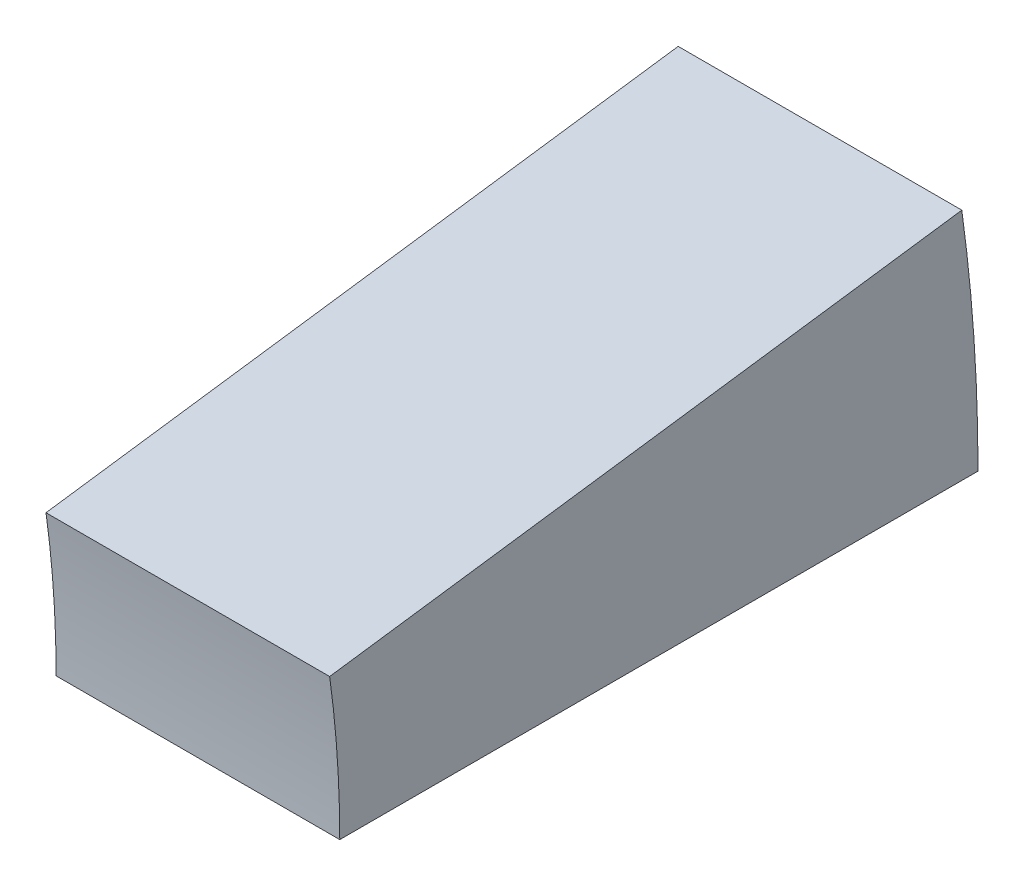
ISO-10303-21;
HEADER;
FILE_DESCRIPTION(('STEP AP214'),'2;1');
FILE_NAME('part.step','',(''),(''),'','','');
FILE_SCHEMA(('AUTOMOTIVE_DESIGN { 1 0 10303 214 1 1 1 1 }'));
ENDSEC;
DATA;
#1=APPLICATION_CONTEXT('core data for automotive mechanical design processes');
#2=APPLICATION_PROTOCOL_DEFINITION('international standard','automotive_design',2000,#1);
#3=PRODUCT_CONTEXT('',#1,'mechanical');
#4=PRODUCT('Part','Part','',(#3));
#5=PRODUCT_RELATED_PRODUCT_CATEGORY('part','',(#4));
#6=PRODUCT_DEFINITION_FORMATION('','',#4);
#7=PRODUCT_DEFINITION_CONTEXT('part definition',#1,'design');
#8=PRODUCT_DEFINITION('design','',#6,#7);
#9=PRODUCT_DEFINITION_SHAPE('','',#8);
#10=(LENGTH_UNIT() NAMED_UNIT(*) SI_UNIT(.MILLI.,.METRE.));
#11=(NAMED_UNIT(*) PLANE_ANGLE_UNIT() SI_UNIT($,.RADIAN.));
#12=(NAMED_UNIT(*) SI_UNIT($,.STERADIAN.) SOLID_ANGLE_UNIT());
#13=UNCERTAINTY_MEASURE_WITH_UNIT(LENGTH_MEASURE(1.E-05),#10,'distance_accuracy_value','');
#14=(GEOMETRIC_REPRESENTATION_CONTEXT(3) GLOBAL_UNCERTAINTY_ASSIGNED_CONTEXT((#13)) GLOBAL_UNIT_ASSIGNED_CONTEXT((#10,
#11,#12)) REPRESENTATION_CONTEXT('',''));
#15=CARTESIAN_POINT('',(0.,0.,0.));
#16=DIRECTION('',(0.,0.,1.));
#17=DIRECTION('',(1.,0.,0.));
#18=AXIS2_PLACEMENT_3D('',#15,#16,#17);
#19=CARTESIAN_POINT('',(0.,20.,0.));
#20=DIRECTION('',(1.,0.,0.));
#21=DIRECTION('',(0.,0.,-1.));
#22=AXIS2_PLACEMENT_3D('',#19,#20,#21);
#23=PLANE('',#22);
#24=CARTESIAN_POINT('',(0.,0.,0.));
#25=DIRECTION('',(1.,0.,0.));
#26=DIRECTION('',(0.,0.,-1.));
#27=AXIS2_PLACEMENT_3D('',#24,#25,#26);
#28=CIRCLE('',#27,90.);
#29=CARTESIAN_POINT('',(0.,0.,-90.));
#30=VERTEX_POINT('',#29);
#31=CARTESIAN_POINT('',(0.,12.3811534147219,-89.1443045859976));
#32=VERTEX_POINT('',#31);
#33=EDGE_CURVE('E74',#30,#32,#28,.T.);
#34=ORIENTED_EDGE('',*,*,#33,.T.);
#35=DIRECTION('',(0.,0.137568371274688,-0.990492273177752));
#36=VECTOR('',#35,1.);
#37=CARTESIAN_POINT('',(0.,20.,-144.));
#38=LINE('',#37,#36);
#39=CARTESIAN_POINT('',(0.,19.809845463555,-142.630887337596));
#40=VERTEX_POINT('',#39);
#41=EDGE_CURVE('E54',#32,#40,#38,.T.);
#42=ORIENTED_EDGE('',*,*,#41,.T.);
#43=CARTESIAN_POINT('',(0.,0.,0.));
#44=DIRECTION('',(-1.,0.,0.));
#45=DIRECTION('',(0.,0.,1.));
#46=AXIS2_PLACEMENT_3D('',#43,#44,#45);
#47=CIRCLE('',#46,144.);
#48=CARTESIAN_POINT('',(0.,0.,-144.));
#49=VERTEX_POINT('',#48);
#50=EDGE_CURVE('E103',#40,#49,#47,.T.);
#51=ORIENTED_EDGE('',*,*,#50,.T.);
#52=DIRECTION('',(0.,0.,1.));
#53=VECTOR('',#52,1.);
#54=CARTESIAN_POINT('',(0.,0.,0.));
#55=LINE('',#54,#53);
#56=EDGE_CURVE('E92',#49,#30,#55,.T.);
#57=ORIENTED_EDGE('',*,*,#56,.T.);
#58=EDGE_LOOP('',(#34,#42,#51,#57));
#59=FACE_BOUND('',#58,.T.);
#60=ADVANCED_FACE('F33',(#59),#23,.F.);
#61=CARTESIAN_POINT('',(24.,20.,0.));
#62=DIRECTION('',(-1.,0.,0.));
#63=DIRECTION('',(0.,0.,1.));
#64=AXIS2_PLACEMENT_3D('',#61,#62,#63);
#65=PLANE('',#64);
#66=CARTESIAN_POINT('',(24.,0.,0.));
#67=DIRECTION('',(1.,0.,0.));
#68=DIRECTION('',(0.,0.,-1.));
#69=AXIS2_PLACEMENT_3D('',#66,#67,#68);
#70=CIRCLE('',#69,90.);
#71=CARTESIAN_POINT('',(24.,0.,-90.));
#72=VERTEX_POINT('',#71);
#73=CARTESIAN_POINT('',(24.,12.3811534147219,-89.1443045859976));
#74=VERTEX_POINT('',#73);
#75=EDGE_CURVE('E46',#72,#74,#70,.T.);
#76=ORIENTED_EDGE('',*,*,#75,.F.);
#77=DIRECTION('',(0.,0.,-1.));
#78=VECTOR('',#77,1.);
#79=CARTESIAN_POINT('',(24.,0.,0.));
#80=LINE('',#79,#78);
#81=CARTESIAN_POINT('',(24.,0.,-144.));
#82=VERTEX_POINT('',#81);
#83=EDGE_CURVE('E85',#72,#82,#80,.T.);
#84=ORIENTED_EDGE('',*,*,#83,.T.);
#85=CARTESIAN_POINT('',(24.,0.,0.));
#86=DIRECTION('',(-1.,0.,0.));
#87=DIRECTION('',(0.,0.,1.));
#88=AXIS2_PLACEMENT_3D('',#85,#86,#87);
#89=CIRCLE('',#88,144.);
#90=CARTESIAN_POINT('',(24.,19.809845463555,-142.630887337596));
#91=VERTEX_POINT('',#90);
#92=EDGE_CURVE('E79',#91,#82,#89,.T.);
#93=ORIENTED_EDGE('',*,*,#92,.F.);
#94=DIRECTION('',(0.,0.137568371274688,-0.990492273177752));
#95=VECTOR('',#94,1.);
#96=CARTESIAN_POINT('',(24.,20.,-144.));
#97=LINE('',#96,#95);
#98=EDGE_CURVE('E87',#74,#91,#97,.T.);
#99=ORIENTED_EDGE('',*,*,#98,.F.);
#100=EDGE_LOOP('',(#76,#84,#93,#99));
#101=FACE_BOUND('',#100,.T.);
#102=ADVANCED_FACE('F83',(#101),#65,.F.);
#103=CARTESIAN_POINT('',(0.,0.,0.));
#104=DIRECTION('',(0.,-1.,0.));
#105=DIRECTION('',(0.,0.,-1.));
#106=AXIS2_PLACEMENT_3D('',#103,#104,#105);
#107=PLANE('',#106);
#108=ORIENTED_EDGE('',*,*,#83,.F.);
#109=DIRECTION('',(1.,0.,0.));
#110=VECTOR('',#109,1.);
#111=CARTESIAN_POINT('',(24.,0.,-90.));
#112=LINE('',#111,#110);
#113=EDGE_CURVE('E72',#72,#30,#112,.F.);
#114=ORIENTED_EDGE('',*,*,#113,.T.);
#115=ORIENTED_EDGE('',*,*,#56,.F.);
#116=DIRECTION('',(-1.,0.,0.));
#117=VECTOR('',#116,1.);
#118=CARTESIAN_POINT('',(0.,0.,-144.));
#119=LINE('',#118,#117);
#120=EDGE_CURVE('E91',#82,#49,#119,.T.);
#121=ORIENTED_EDGE('',*,*,#120,.F.);
#122=EDGE_LOOP('',(#108,#114,#115,#121));
#123=FACE_BOUND('',#122,.T.);
#124=ADVANCED_FACE('F90',(#123),#107,.T.);
#125=CARTESIAN_POINT('',(0.,20.,-144.));
#126=DIRECTION('',(0.,-0.990492273177752,-0.137568371274688));
#127=DIRECTION('',(0.,0.137568371274688,-0.990492273177752));
#128=AXIS2_PLACEMENT_3D('',#125,#126,#127);
#129=PLANE('',#128);
#130=DIRECTION('',(1.,0.,0.));
#131=VECTOR('',#130,1.);
#132=CARTESIAN_POINT('',(24.,12.3811534147219,-89.1443045859976));
#133=LINE('',#132,#131);
#134=EDGE_CURVE('E11',#74,#32,#133,.F.);
#135=ORIENTED_EDGE('',*,*,#134,.F.);
#136=ORIENTED_EDGE('',*,*,#98,.T.);
#137=DIRECTION('',(-1.,0.,0.));
#138=VECTOR('',#137,1.);
#139=CARTESIAN_POINT('',(0.,19.809845463555,-142.630887337596));
#140=LINE('',#139,#138);
#141=EDGE_CURVE('E40',#91,#40,#140,.T.);
#142=ORIENTED_EDGE('',*,*,#141,.T.);
#143=ORIENTED_EDGE('',*,*,#41,.F.);
#144=EDGE_LOOP('',(#135,#136,#142,#143));
#145=FACE_BOUND('',#144,.T.);
#146=ADVANCED_FACE('F100',(#145),#129,.F.);
#147=CARTESIAN_POINT('',(0.,0.,0.));
#148=DIRECTION('',(-1.,0.,0.));
#149=DIRECTION('',(0.,0.,1.));
#150=AXIS2_PLACEMENT_3D('',#147,#148,#149);
#151=CYLINDRICAL_SURFACE('',#150,144.);
#152=ORIENTED_EDGE('',*,*,#120,.T.);
#153=ORIENTED_EDGE('',*,*,#50,.F.);
#154=ORIENTED_EDGE('',*,*,#141,.F.);
#155=ORIENTED_EDGE('',*,*,#92,.T.);
#156=EDGE_LOOP('',(#152,#153,#154,#155));
#157=FACE_BOUND('',#156,.T.);
#158=ADVANCED_FACE('F102',(#157),#151,.T.);
#159=CARTESIAN_POINT('',(24.,0.,0.));
#160=DIRECTION('',(1.,0.,0.));
#161=DIRECTION('',(0.,0.,-1.));
#162=AXIS2_PLACEMENT_3D('',#159,#160,#161);
#163=CYLINDRICAL_SURFACE('',#162,90.);
#164=ORIENTED_EDGE('',*,*,#75,.T.);
#165=ORIENTED_EDGE('',*,*,#134,.T.);
#166=ORIENTED_EDGE('',*,*,#33,.F.);
#167=ORIENTED_EDGE('',*,*,#113,.F.);
#168=EDGE_LOOP('',(#164,#165,#166,#167));
#169=FACE_BOUND('',#168,.T.);
#170=ADVANCED_FACE('F73',(#169),#163,.F.);
#171=CLOSED_SHELL('',(#60,#102,#124,#146,#158,#170));
#172=MANIFOLD_SOLID_BREP('B2',#171);
#173=ADVANCED_BREP_SHAPE_REPRESENTATION('',(#18,#172),#14);
#174=SHAPE_DEFINITION_REPRESENTATION(#9,#173);
ENDSEC;
END-ISO-10303-21;
